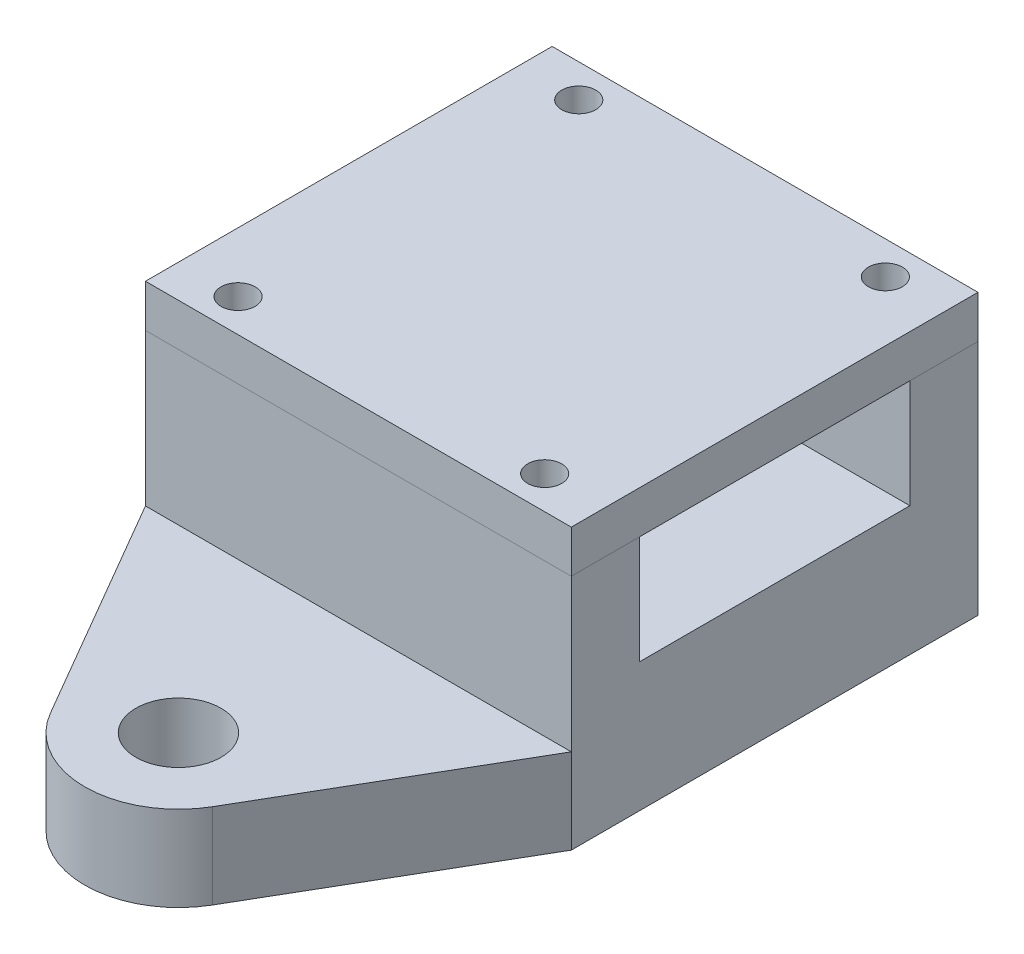
ISO-10303-21;
HEADER;
FILE_DESCRIPTION(('STEP AP214'),'2;1');
FILE_NAME('part.step','',(''),(''),'','','');
FILE_SCHEMA(('AUTOMOTIVE_DESIGN { 1 0 10303 214 1 1 1 1 }'));
ENDSEC;
DATA;
#1=APPLICATION_CONTEXT('core data for automotive mechanical design processes');
#2=APPLICATION_PROTOCOL_DEFINITION('international standard','automotive_design',2000,#1);
#3=PRODUCT_CONTEXT('',#1,'mechanical');
#4=PRODUCT('Part','Part','',(#3));
#5=PRODUCT_RELATED_PRODUCT_CATEGORY('part','',(#4));
#6=PRODUCT_DEFINITION_FORMATION('','',#4);
#7=PRODUCT_DEFINITION_CONTEXT('part definition',#1,'design');
#8=PRODUCT_DEFINITION('design','',#6,#7);
#9=PRODUCT_DEFINITION_SHAPE('','',#8);
#10=(LENGTH_UNIT() NAMED_UNIT(*) SI_UNIT(.MILLI.,.METRE.));
#11=(NAMED_UNIT(*) PLANE_ANGLE_UNIT() SI_UNIT($,.RADIAN.));
#12=(NAMED_UNIT(*) SI_UNIT($,.STERADIAN.) SOLID_ANGLE_UNIT());
#13=UNCERTAINTY_MEASURE_WITH_UNIT(LENGTH_MEASURE(1.E-05),#10,'distance_accuracy_value','');
#14=(GEOMETRIC_REPRESENTATION_CONTEXT(3) GLOBAL_UNCERTAINTY_ASSIGNED_CONTEXT((#13)) GLOBAL_UNIT_ASSIGNED_CONTEXT((#10,
#11,#12)) REPRESENTATION_CONTEXT('',''));
#15=CARTESIAN_POINT('',(0.,0.,0.));
#16=DIRECTION('',(0.,0.,1.));
#17=DIRECTION('',(1.,0.,0.));
#18=AXIS2_PLACEMENT_3D('',#15,#16,#17);
#19=CARTESIAN_POINT('',(-2634.2,685.964044395312,20.));
#20=DIRECTION('',(0.,1.,0.));
#21=DIRECTION('',(0.,0.,1.));
#22=AXIS2_PLACEMENT_3D('',#19,#20,#21);
#23=CYLINDRICAL_SURFACE('',#22,1.99999999999966);
#24=CARTESIAN_POINT('',(-2634.2,749.3,20.));
#25=DIRECTION('',(0.,1.,0.));
#26=DIRECTION('',(0.,0.,1.));
#27=AXIS2_PLACEMENT_3D('',#24,#25,#26);
#28=CIRCLE('',#27,1.99999999999966);
#29=CARTESIAN_POINT('',(-2634.2,749.3,21.9999999999997));
#30=VERTEX_POINT('',#29);
#31=EDGE_CURVE('E231',#30,#30,#28,.T.);
#32=ORIENTED_EDGE('',*,*,#31,.T.);
#33=EDGE_LOOP('',(#32));
#34=FACE_BOUND('',#33,.T.);
#35=CARTESIAN_POINT('',(-2634.2,721.45,20.));
#36=DIRECTION('',(0.,1.,0.));
#37=DIRECTION('',(0.,0.,1.));
#38=AXIS2_PLACEMENT_3D('',#35,#36,#37);
#39=CIRCLE('',#38,1.99999999999966);
#40=CARTESIAN_POINT('',(-2634.2,721.45,21.9999999999997));
#41=VERTEX_POINT('',#40);
#42=EDGE_CURVE('E206',#41,#41,#39,.T.);
#43=ORIENTED_EDGE('',*,*,#42,.F.);
#44=EDGE_LOOP('',(#43));
#45=FACE_BOUND('',#44,.T.);
#46=ADVANCED_FACE('F53',(#34,#45),#23,.F.);
#47=CARTESIAN_POINT('',(-2598.2,685.964044395312,20.));
#48=DIRECTION('',(0.,1.,0.));
#49=DIRECTION('',(0.,0.,1.));
#50=AXIS2_PLACEMENT_3D('',#47,#48,#49);
#51=CYLINDRICAL_SURFACE('',#50,1.99999999999966);
#52=CARTESIAN_POINT('',(-2598.2,749.3,20.));
#53=DIRECTION('',(0.,1.,0.));
#54=DIRECTION('',(0.,0.,1.));
#55=AXIS2_PLACEMENT_3D('',#52,#53,#54);
#56=CIRCLE('',#55,1.99999999999966);
#57=CARTESIAN_POINT('',(-2598.2,749.3,21.9999999999997));
#58=VERTEX_POINT('',#57);
#59=EDGE_CURVE('E227',#58,#58,#56,.T.);
#60=ORIENTED_EDGE('',*,*,#59,.T.);
#61=EDGE_LOOP('',(#60));
#62=FACE_BOUND('',#61,.T.);
#63=CARTESIAN_POINT('',(-2598.2,721.45,20.));
#64=DIRECTION('',(0.,1.,0.));
#65=DIRECTION('',(0.,0.,1.));
#66=AXIS2_PLACEMENT_3D('',#63,#64,#65);
#67=CIRCLE('',#66,1.99999999999966);
#68=CARTESIAN_POINT('',(-2598.2,721.45,21.9999999999997));
#69=VERTEX_POINT('',#68);
#70=EDGE_CURVE('E203',#69,#69,#67,.T.);
#71=ORIENTED_EDGE('',*,*,#70,.F.);
#72=EDGE_LOOP('',(#71));
#73=FACE_BOUND('',#72,.T.);
#74=ADVANCED_FACE('F55',(#62,#73),#51,.F.);
#75=CARTESIAN_POINT('',(0.,749.3,0.));
#76=DIRECTION('',(0.,1.,0.));
#77=DIRECTION('',(0.,0.,1.));
#78=AXIS2_PLACEMENT_3D('',#75,#76,#77);
#79=PLANE('',#78);
#80=ORIENTED_EDGE('',*,*,#59,.F.);
#81=EDGE_LOOP('',(#80));
#82=FACE_BOUND('',#81,.T.);
#83=ORIENTED_EDGE('',*,*,#31,.F.);
#84=EDGE_LOOP('',(#83));
#85=FACE_BOUND('',#84,.T.);
#86=DIRECTION('',(1.,0.,0.));
#87=VECTOR('',#86,1.);
#88=CARTESIAN_POINT('',(0.,749.3,15.875));
#89=LINE('',#88,#87);
#90=CARTESIAN_POINT('',(-2641.2,749.3,15.8749999999999));
#91=VERTEX_POINT('',#90);
#92=CARTESIAN_POINT('',(-2591.2,749.3,15.8749999999999));
#93=VERTEX_POINT('',#92);
#94=EDGE_CURVE('E234',#91,#93,#89,.T.);
#95=ORIENTED_EDGE('',*,*,#94,.F.);
#96=DIRECTION('',(0.,0.,-1.));
#97=VECTOR('',#96,1.);
#98=CARTESIAN_POINT('',(-2641.2,749.3,0.));
#99=LINE('',#98,#97);
#100=CARTESIAN_POINT('',(-2641.2,749.3,23.875));
#101=VERTEX_POINT('',#100);
#102=EDGE_CURVE('E237',#101,#91,#99,.T.);
#103=ORIENTED_EDGE('',*,*,#102,.F.);
#104=DIRECTION('',(1.,0.,0.));
#105=VECTOR('',#104,1.);
#106=CARTESIAN_POINT('',(0.,749.3,23.875));
#107=LINE('',#106,#105);
#108=CARTESIAN_POINT('',(-2591.2,749.3,23.875));
#109=VERTEX_POINT('',#108);
#110=EDGE_CURVE('E240',#101,#109,#107,.T.);
#111=ORIENTED_EDGE('',*,*,#110,.T.);
#112=DIRECTION('',(0.,0.,1.));
#113=VECTOR('',#112,1.);
#114=CARTESIAN_POINT('',(-2591.2,749.3,0.));
#115=LINE('',#114,#113);
#116=EDGE_CURVE('E243',#93,#109,#115,.T.);
#117=ORIENTED_EDGE('',*,*,#116,.F.);
#118=EDGE_LOOP('',(#95,#103,#111,#117));
#119=FACE_BOUND('',#118,.T.);
#120=ADVANCED_FACE('F264',(#82,#85,#119),#79,.T.);
#121=CARTESIAN_POINT('',(-2641.2,685.964044395312,0.));
#122=DIRECTION('',(1.,0.,0.));
#123=DIRECTION('',(0.,0.,-1.));
#124=AXIS2_PLACEMENT_3D('',#121,#122,#123);
#125=PLANE('',#124);
#126=DIRECTION('',(0.,1.,0.));
#127=VECTOR('',#126,1.);
#128=CARTESIAN_POINT('',(-2641.2,685.964044395312,15.8749999999999));
#129=LINE('',#128,#127);
#130=CARTESIAN_POINT('',(-2641.2,736.6,15.8749999999999));
#131=VERTEX_POINT('',#130);
#132=EDGE_CURVE('E57',#131,#91,#129,.T.);
#133=ORIENTED_EDGE('',*,*,#132,.F.);
#134=DIRECTION('',(0.,0.,-1.));
#135=VECTOR('',#134,1.);
#136=CARTESIAN_POINT('',(-2641.2,736.6,0.));
#137=LINE('',#136,#135);
#138=CARTESIAN_POINT('',(-2641.2,736.6,-15.8749999999999));
#139=VERTEX_POINT('',#138);
#140=EDGE_CURVE('E217',#131,#139,#137,.T.);
#141=ORIENTED_EDGE('',*,*,#140,.T.);
#142=DIRECTION('',(0.,1.,0.));
#143=VECTOR('',#142,1.);
#144=CARTESIAN_POINT('',(-2641.2,685.964044395312,-15.8749999999999));
#145=LINE('',#144,#143);
#146=CARTESIAN_POINT('',(-2641.2,749.3,-15.8749999999999));
#147=VERTEX_POINT('',#146);
#148=EDGE_CURVE('E78',#139,#147,#145,.T.);
#149=ORIENTED_EDGE('',*,*,#148,.T.);
#150=DIRECTION('',(0.,0.,-1.));
#151=VECTOR('',#150,1.);
#152=CARTESIAN_POINT('',(-2641.2,749.3,0.));
#153=LINE('',#152,#151);
#154=CARTESIAN_POINT('',(-2641.2,749.3,-23.8749999999999));
#155=VERTEX_POINT('',#154);
#156=EDGE_CURVE('E181',#147,#155,#153,.T.);
#157=ORIENTED_EDGE('',*,*,#156,.T.);
#158=DIRECTION('',(0.,1.,0.));
#159=VECTOR('',#158,1.);
#160=CARTESIAN_POINT('',(-2641.2,721.45,-23.8749999999999));
#161=LINE('',#160,#159);
#162=CARTESIAN_POINT('',(-2641.2,721.45,-23.8749999999999));
#163=VERTEX_POINT('',#162);
#164=EDGE_CURVE('E225',#163,#155,#161,.T.);
#165=ORIENTED_EDGE('',*,*,#164,.F.);
#166=DIRECTION('',(0.,0.,-1.));
#167=VECTOR('',#166,1.);
#168=CARTESIAN_POINT('',(-2641.2,721.45,0.));
#169=LINE('',#168,#167);
#170=CARTESIAN_POINT('',(-2641.2,721.45,23.875));
#171=VERTEX_POINT('',#170);
#172=EDGE_CURVE('E219',#171,#163,#169,.T.);
#173=ORIENTED_EDGE('',*,*,#172,.F.);
#174=DIRECTION('',(0.,1.,0.));
#175=VECTOR('',#174,1.);
#176=CARTESIAN_POINT('',(-2641.2,685.964044395312,23.875));
#177=LINE('',#176,#175);
#178=CARTESIAN_POINT('',(-2641.2,731.45,23.875));
#179=VERTEX_POINT('',#178);
#180=EDGE_CURVE('E250',#171,#179,#177,.T.);
#181=ORIENTED_EDGE('',*,*,#180,.T.);
#182=EDGE_CURVE('E251',#179,#101,#177,.T.);
#183=ORIENTED_EDGE('',*,*,#182,.T.);
#184=ORIENTED_EDGE('',*,*,#102,.T.);
#185=EDGE_LOOP('',(#133,#141,#149,#157,#165,#173,#181,#183,#184));
#186=FACE_BOUND('',#185,.T.);
#187=ADVANCED_FACE('F260',(#186),#125,.F.);
#188=CARTESIAN_POINT('',(0.,685.964044395312,23.875));
#189=DIRECTION('',(0.,0.,1.));
#190=DIRECTION('',(1.,0.,0.));
#191=AXIS2_PLACEMENT_3D('',#188,#189,#190);
#192=PLANE('',#191);
#193=DIRECTION('',(-1.,0.,0.));
#194=VECTOR('',#193,1.);
#195=CARTESIAN_POINT('',(0.,731.45,23.875));
#196=LINE('',#195,#194);
#197=CARTESIAN_POINT('',(-2591.2,731.45,23.875));
#198=VERTEX_POINT('',#197);
#199=EDGE_CURVE('E70',#198,#179,#196,.T.);
#200=ORIENTED_EDGE('',*,*,#199,.F.);
#201=DIRECTION('',(0.,1.,0.));
#202=VECTOR('',#201,1.);
#203=CARTESIAN_POINT('',(-2591.2,685.964044395312,23.875));
#204=LINE('',#203,#202);
#205=EDGE_CURVE('E249',#198,#109,#204,.T.);
#206=ORIENTED_EDGE('',*,*,#205,.T.);
#207=ORIENTED_EDGE('',*,*,#110,.F.);
#208=ORIENTED_EDGE('',*,*,#182,.F.);
#209=EDGE_LOOP('',(#200,#206,#207,#208));
#210=FACE_BOUND('',#209,.T.);
#211=ADVANCED_FACE('F309',(#210),#192,.T.);
#212=CARTESIAN_POINT('',(-2591.2,685.964044395312,0.));
#213=DIRECTION('',(-1.,0.,0.));
#214=DIRECTION('',(0.,0.,1.));
#215=AXIS2_PLACEMENT_3D('',#212,#213,#214);
#216=PLANE('',#215);
#217=CARTESIAN_POINT('',(-2591.2,721.45,23.875));
#218=VERTEX_POINT('',#217);
#219=EDGE_CURVE('E247',#218,#198,#204,.T.);
#220=ORIENTED_EDGE('',*,*,#219,.F.);
#221=DIRECTION('',(0.,0.,1.));
#222=VECTOR('',#221,1.);
#223=CARTESIAN_POINT('',(-2591.2,721.45,0.));
#224=LINE('',#223,#222);
#225=CARTESIAN_POINT('',(-2591.2,721.45,-23.8749999999999));
#226=VERTEX_POINT('',#225);
#227=EDGE_CURVE('E213',#226,#218,#224,.T.);
#228=ORIENTED_EDGE('',*,*,#227,.F.);
#229=DIRECTION('',(0.,1.,0.));
#230=VECTOR('',#229,1.);
#231=CARTESIAN_POINT('',(-2591.2,721.45,-23.8749999999999));
#232=LINE('',#231,#230);
#233=CARTESIAN_POINT('',(-2591.2,749.3,-23.8749999999999));
#234=VERTEX_POINT('',#233);
#235=EDGE_CURVE('E221',#226,#234,#232,.T.);
#236=ORIENTED_EDGE('',*,*,#235,.T.);
#237=DIRECTION('',(0.,0.,1.));
#238=VECTOR('',#237,1.);
#239=CARTESIAN_POINT('',(-2591.2,749.3,0.));
#240=LINE('',#239,#238);
#241=CARTESIAN_POINT('',(-2591.2,749.3,-15.8749999999999));
#242=VERTEX_POINT('',#241);
#243=EDGE_CURVE('E180',#234,#242,#240,.T.);
#244=ORIENTED_EDGE('',*,*,#243,.T.);
#245=DIRECTION('',(0.,1.,0.));
#246=VECTOR('',#245,1.);
#247=CARTESIAN_POINT('',(-2591.2,685.964044395312,-15.8749999999999));
#248=LINE('',#247,#246);
#249=CARTESIAN_POINT('',(-2591.2,736.6,-15.8749999999999));
#250=VERTEX_POINT('',#249);
#251=EDGE_CURVE('E189',#250,#242,#248,.T.);
#252=ORIENTED_EDGE('',*,*,#251,.F.);
#253=DIRECTION('',(0.,0.,1.));
#254=VECTOR('',#253,1.);
#255=CARTESIAN_POINT('',(-2591.2,736.6,0.));
#256=LINE('',#255,#254);
#257=CARTESIAN_POINT('',(-2591.2,736.6,15.8749999999999));
#258=VERTEX_POINT('',#257);
#259=EDGE_CURVE('E212',#250,#258,#256,.T.);
#260=ORIENTED_EDGE('',*,*,#259,.T.);
#261=DIRECTION('',(0.,1.,0.));
#262=VECTOR('',#261,1.);
#263=CARTESIAN_POINT('',(-2591.2,685.964044395312,15.8749999999999));
#264=LINE('',#263,#262);
#265=EDGE_CURVE('E62',#258,#93,#264,.T.);
#266=ORIENTED_EDGE('',*,*,#265,.T.);
#267=ORIENTED_EDGE('',*,*,#116,.T.);
#268=ORIENTED_EDGE('',*,*,#205,.F.);
#269=EDGE_LOOP('',(#220,#228,#236,#244,#252,#260,#266,#267,#268));
#270=FACE_BOUND('',#269,.T.);
#271=ADVANCED_FACE('F266',(#270),#216,.F.);
#272=CARTESIAN_POINT('',(0.,685.964044395312,15.875));
#273=DIRECTION('',(0.,0.,1.));
#274=DIRECTION('',(1.,0.,0.));
#275=AXIS2_PLACEMENT_3D('',#272,#273,#274);
#276=PLANE('',#275);
#277=ORIENTED_EDGE('',*,*,#265,.F.);
#278=DIRECTION('',(-1.,0.,0.));
#279=VECTOR('',#278,1.);
#280=CARTESIAN_POINT('',(0.,736.6,15.875));
#281=LINE('',#280,#279);
#282=EDGE_CURVE('E12',#258,#131,#281,.T.);
#283=ORIENTED_EDGE('',*,*,#282,.T.);
#284=ORIENTED_EDGE('',*,*,#132,.T.);
#285=ORIENTED_EDGE('',*,*,#94,.T.);
#286=EDGE_LOOP('',(#277,#283,#284,#285));
#287=FACE_BOUND('',#286,.T.);
#288=ADVANCED_FACE('F257',(#287),#276,.F.);
#289=CARTESIAN_POINT('',(-2997.2,721.45,-23.8749999999999));
#290=DIRECTION('',(0.,0.,1.));
#291=DIRECTION('',(1.,0.,0.));
#292=AXIS2_PLACEMENT_3D('',#289,#290,#291);
#293=PLANE('',#292);
#294=ORIENTED_EDGE('',*,*,#164,.T.);
#295=DIRECTION('',(1.,0.,0.));
#296=VECTOR('',#295,1.);
#297=CARTESIAN_POINT('',(0.,749.3,-23.8749999999999));
#298=LINE('',#297,#296);
#299=EDGE_CURVE('E177',#155,#234,#298,.T.);
#300=ORIENTED_EDGE('',*,*,#299,.T.);
#301=ORIENTED_EDGE('',*,*,#235,.F.);
#302=DIRECTION('',(1.,0.,0.));
#303=VECTOR('',#302,1.);
#304=CARTESIAN_POINT('',(-2997.2,721.45,-23.8749999999999));
#305=LINE('',#304,#303);
#306=EDGE_CURVE('E216',#163,#226,#305,.T.);
#307=ORIENTED_EDGE('',*,*,#306,.F.);
#308=EDGE_LOOP('',(#294,#300,#301,#307));
#309=FACE_BOUND('',#308,.T.);
#310=ADVANCED_FACE('F281',(#309),#293,.F.);
#311=CARTESIAN_POINT('',(0.,721.45,0.));
#312=DIRECTION('',(0.,-1.,0.));
#313=DIRECTION('',(0.,0.,-1.));
#314=AXIS2_PLACEMENT_3D('',#311,#312,#313);
#315=PLANE('',#314);
#316=CARTESIAN_POINT('',(-2634.2,721.45,-20.));
#317=DIRECTION('',(0.,1.,0.));
#318=DIRECTION('',(0.,0.,1.));
#319=AXIS2_PLACEMENT_3D('',#316,#317,#318);
#320=CIRCLE('',#319,1.99999999999966);
#321=CARTESIAN_POINT('',(-2634.2,721.45,-18.0000000000003));
#322=VERTEX_POINT('',#321);
#323=EDGE_CURVE('E198',#322,#322,#320,.T.);
#324=ORIENTED_EDGE('',*,*,#323,.T.);
#325=EDGE_LOOP('',(#324));
#326=FACE_BOUND('',#325,.T.);
#327=ORIENTED_EDGE('',*,*,#70,.T.);
#328=EDGE_LOOP('',(#327));
#329=FACE_BOUND('',#328,.T.);
#330=ORIENTED_EDGE('',*,*,#42,.T.);
#331=EDGE_LOOP('',(#330));
#332=FACE_BOUND('',#331,.T.);
#333=CARTESIAN_POINT('',(-2598.2,721.45,-20.));
#334=DIRECTION('',(0.,1.,0.));
#335=DIRECTION('',(0.,0.,1.));
#336=AXIS2_PLACEMENT_3D('',#333,#334,#335);
#337=CIRCLE('',#336,1.99999999999966);
#338=CARTESIAN_POINT('',(-2598.2,721.45,-18.0000000000003));
#339=VERTEX_POINT('',#338);
#340=EDGE_CURVE('E209',#339,#339,#337,.T.);
#341=ORIENTED_EDGE('',*,*,#340,.T.);
#342=EDGE_LOOP('',(#341));
#343=FACE_BOUND('',#342,.T.);
#344=ORIENTED_EDGE('',*,*,#227,.T.);
#345=DIRECTION('',(0.502475254915901,0.,-0.864591590403932));
#346=VECTOR('',#345,1.);
#347=CARTESIAN_POINT('',(-1926.59808684269,721.45,-1119.68225871187));
#348=LINE('',#347,#346);
#349=CARTESIAN_POINT('',(-2606.68949250556,721.45,50.5272278040751));
#350=VERTEX_POINT('',#349);
#351=EDGE_CURVE('E162',#350,#218,#348,.T.);
#352=ORIENTED_EDGE('',*,*,#351,.F.);
#353=CARTESIAN_POINT('',(-2616.2,721.45,45.));
#354=DIRECTION('',(0.,-1.,0.));
#355=DIRECTION('',(0.,0.,-1.));
#356=AXIS2_PLACEMENT_3D('',#353,#354,#355);
#357=CIRCLE('',#356,10.9999999999998);
#358=CARTESIAN_POINT('',(-2625.71050749444,721.45,50.5272278040745));
#359=VERTEX_POINT('',#358);
#360=EDGE_CURVE('E172',#350,#359,#357,.T.);
#361=ORIENTED_EDGE('',*,*,#360,.T.);
#362=DIRECTION('',(-0.502475254915901,0.,-0.864591590403932));
#363=VECTOR('',#362,1.);
#364=CARTESIAN_POINT('',(-1984.71833101234,721.45,1153.46003868228));
#365=LINE('',#364,#363);
#366=EDGE_CURVE('E146',#359,#171,#365,.T.);
#367=ORIENTED_EDGE('',*,*,#366,.T.);
#368=ORIENTED_EDGE('',*,*,#172,.T.);
#369=ORIENTED_EDGE('',*,*,#306,.T.);
#370=EDGE_LOOP('',(#344,#352,#361,#367,#368,#369));
#371=FACE_BOUND('',#370,.T.);
#372=CARTESIAN_POINT('',(-2616.2,721.45,45.));
#373=DIRECTION('',(0.,-1.,0.));
#374=DIRECTION('',(0.,0.,-1.));
#375=AXIS2_PLACEMENT_3D('',#372,#373,#374);
#376=CIRCLE('',#375,4.99999999999982);
#377=CARTESIAN_POINT('',(-2616.2,721.45,40.0000000000002));
#378=VERTEX_POINT('',#377);
#379=EDGE_CURVE('E167',#378,#378,#376,.T.);
#380=ORIENTED_EDGE('',*,*,#379,.F.);
#381=EDGE_LOOP('',(#380));
#382=FACE_BOUND('',#381,.T.);
#383=ADVANCED_FACE('F283',(#326,#329,#332,#343,#371,#382),#315,.T.);
#384=CARTESIAN_POINT('',(0.,736.6,0.));
#385=DIRECTION('',(0.,-1.,0.));
#386=DIRECTION('',(0.,0.,-1.));
#387=AXIS2_PLACEMENT_3D('',#384,#385,#386);
#388=PLANE('',#387);
#389=ORIENTED_EDGE('',*,*,#259,.F.);
#390=DIRECTION('',(-1.,0.,0.));
#391=VECTOR('',#390,1.);
#392=CARTESIAN_POINT('',(0.,736.6,-15.8749999999997));
#393=LINE('',#392,#391);
#394=EDGE_CURVE('E188',#250,#139,#393,.T.);
#395=ORIENTED_EDGE('',*,*,#394,.T.);
#396=ORIENTED_EDGE('',*,*,#140,.F.);
#397=ORIENTED_EDGE('',*,*,#282,.F.);
#398=EDGE_LOOP('',(#389,#395,#396,#397));
#399=FACE_BOUND('',#398,.T.);
#400=ADVANCED_FACE('F269',(#399),#388,.F.);
#401=CARTESIAN_POINT('',(-2598.2,721.45,-20.));
#402=DIRECTION('',(0.,1.,0.));
#403=DIRECTION('',(0.,0.,1.));
#404=AXIS2_PLACEMENT_3D('',#401,#402,#403);
#405=CYLINDRICAL_SURFACE('',#404,1.99999999999966);
#406=CARTESIAN_POINT('',(-2598.2,749.3,-20.));
#407=DIRECTION('',(0.,1.,0.));
#408=DIRECTION('',(0.,0.,1.));
#409=AXIS2_PLACEMENT_3D('',#406,#407,#408);
#410=CIRCLE('',#409,1.99999999999966);
#411=CARTESIAN_POINT('',(-2598.2,749.3,-18.0000000000003));
#412=VERTEX_POINT('',#411);
#413=EDGE_CURVE('E194',#412,#412,#410,.T.);
#414=CARTESIAN_POINT('',(-2598.2,721.45,-18.0000000000003));
#415=CARTESIAN_POINT('',(-2598.2,721.740104166667,-18.0000000000003));
#416=CARTESIAN_POINT('',(-2598.2,722.030208333334,-18.0000000000003));
#417=CARTESIAN_POINT('',(-2598.2,722.610416666667,-18.0000000000003));
#418=CARTESIAN_POINT('',(-2598.2,722.900520833334,-18.0000000000003));
#419=CARTESIAN_POINT('',(-2598.2,723.480729166667,-18.0000000000003));
#420=CARTESIAN_POINT('',(-2598.2,723.770833333334,-18.0000000000003));
#421=CARTESIAN_POINT('',(-2598.2,724.351041666667,-18.0000000000003));
#422=CARTESIAN_POINT('',(-2598.2,724.641145833334,-18.0000000000003));
#423=CARTESIAN_POINT('',(-2598.2,725.221354166667,-18.0000000000003));
#424=CARTESIAN_POINT('',(-2598.2,725.511458333334,-18.0000000000003));
#425=CARTESIAN_POINT('',(-2598.2,726.091666666667,-18.0000000000003));
#426=CARTESIAN_POINT('',(-2598.2,726.381770833334,-18.0000000000003));
#427=CARTESIAN_POINT('',(-2598.2,726.961979166667,-18.0000000000003));
#428=CARTESIAN_POINT('',(-2598.2,727.252083333334,-18.0000000000003));
#429=CARTESIAN_POINT('',(-2598.2,727.832291666667,-18.0000000000003));
#430=CARTESIAN_POINT('',(-2598.2,728.122395833334,-18.0000000000003));
#431=CARTESIAN_POINT('',(-2598.2,728.702604166667,-18.0000000000003));
#432=CARTESIAN_POINT('',(-2598.2,728.992708333334,-18.0000000000003));
#433=CARTESIAN_POINT('',(-2598.2,729.572916666667,-18.0000000000003));
#434=CARTESIAN_POINT('',(-2598.2,729.863020833334,-18.0000000000003));
#435=CARTESIAN_POINT('',(-2598.2,730.443229166667,-18.0000000000003));
#436=CARTESIAN_POINT('',(-2598.2,730.733333333334,-18.0000000000003));
#437=CARTESIAN_POINT('',(-2598.2,731.313541666667,-18.0000000000003));
#438=CARTESIAN_POINT('',(-2598.2,731.603645833334,-18.0000000000003));
#439=CARTESIAN_POINT('',(-2598.2,732.183854166667,-18.0000000000003));
#440=CARTESIAN_POINT('',(-2598.2,732.473958333334,-18.0000000000003));
#441=CARTESIAN_POINT('',(-2598.2,733.054166666667,-18.0000000000003));
#442=CARTESIAN_POINT('',(-2598.2,733.344270833334,-18.0000000000003));
#443=CARTESIAN_POINT('',(-2598.2,733.924479166667,-18.0000000000003));
#444=CARTESIAN_POINT('',(-2598.2,734.214583333334,-18.0000000000003));
#445=CARTESIAN_POINT('',(-2598.2,734.794791666667,-18.0000000000003));
#446=CARTESIAN_POINT('',(-2598.2,735.084895833334,-18.0000000000003));
#447=CARTESIAN_POINT('',(-2598.2,735.665104166667,-18.0000000000003));
#448=CARTESIAN_POINT('',(-2598.2,735.955208333334,-18.0000000000003));
#449=CARTESIAN_POINT('',(-2598.2,736.535416666667,-18.0000000000003));
#450=CARTESIAN_POINT('',(-2598.2,736.825520833334,-18.0000000000003));
#451=CARTESIAN_POINT('',(-2598.2,737.405729166667,-18.0000000000003));
#452=CARTESIAN_POINT('',(-2598.2,737.695833333334,-18.0000000000003));
#453=CARTESIAN_POINT('',(-2598.2,738.276041666667,-18.0000000000003));
#454=CARTESIAN_POINT('',(-2598.2,738.566145833334,-18.0000000000003));
#455=CARTESIAN_POINT('',(-2598.2,739.146354166667,-18.0000000000003));
#456=CARTESIAN_POINT('',(-2598.2,739.436458333334,-18.0000000000003));
#457=CARTESIAN_POINT('',(-2598.2,740.016666666667,-18.0000000000003));
#458=CARTESIAN_POINT('',(-2598.2,740.306770833334,-18.0000000000003));
#459=CARTESIAN_POINT('',(-2598.2,740.886979166667,-18.0000000000003));
#460=CARTESIAN_POINT('',(-2598.2,741.177083333333,-18.0000000000003));
#461=CARTESIAN_POINT('',(-2598.2,741.757291666667,-18.0000000000003));
#462=CARTESIAN_POINT('',(-2598.2,742.047395833334,-18.0000000000003));
#463=CARTESIAN_POINT('',(-2598.2,742.627604166667,-18.0000000000003));
#464=CARTESIAN_POINT('',(-2598.2,742.917708333334,-18.0000000000003));
#465=CARTESIAN_POINT('',(-2598.2,743.497916666667,-18.0000000000003));
#466=CARTESIAN_POINT('',(-2598.2,743.788020833334,-18.0000000000003));
#467=CARTESIAN_POINT('',(-2598.2,744.368229166667,-18.0000000000003));
#468=CARTESIAN_POINT('',(-2598.2,744.658333333334,-18.0000000000003));
#469=CARTESIAN_POINT('',(-2598.2,745.238541666667,-18.0000000000003));
#470=CARTESIAN_POINT('',(-2598.2,745.528645833334,-18.0000000000003));
#471=CARTESIAN_POINT('',(-2598.2,746.108854166667,-18.0000000000003));
#472=CARTESIAN_POINT('',(-2598.2,746.398958333334,-18.0000000000003));
#473=CARTESIAN_POINT('',(-2598.2,746.979166666667,-18.0000000000003));
#474=CARTESIAN_POINT('',(-2598.2,747.269270833334,-18.0000000000003));
#475=CARTESIAN_POINT('',(-2598.2,747.849479166667,-18.0000000000003));
#476=CARTESIAN_POINT('',(-2598.2,748.139583333334,-18.0000000000003));
#477=CARTESIAN_POINT('',(-2598.2,748.719791666667,-18.0000000000003));
#478=CARTESIAN_POINT('',(-2598.2,749.009895833334,-18.0000000000003));
#479=CARTESIAN_POINT('',(-2598.2,749.3,-18.0000000000003));
#480=B_SPLINE_CURVE_WITH_KNOTS('',3,(#414,#415,#416,#417,#418,#419,#420,#421,#422,#423,#424,
#425,#426,#427,#428,#429,#430,#431,#432,#433,#434,#435,#436,#437,#438,#439,#440,#441,#442,#443,
#444,#445,#446,#447,#448,#449,#450,#451,#452,#453,#454,#455,#456,#457,#458,#459,#460,#461,#462,
#463,#464,#465,#466,#467,#468,#469,#470,#471,#472,#473,#474,#475,#476,#477,#478,#479),
.UNSPECIFIED.,.F.,.F.,(4,2,2,2,2,2,2,2,2,2,2,2,2,2,2,2,2,2,2,2,2,2,2,2,2,2,2,2,2,2,2,2,4),(0.,
0.870312499999915,1.74062499999994,2.61093749999997,3.48124999999999,4.35156249999991,
5.22187499999993,6.09218749999996,6.96249999999998,7.83281250000001,8.70312499999992,
9.57343749999995,10.44375,11.3140625,12.1843749999999,13.0546874999999,13.925,14.7953125,
15.665625,16.5359374999999,17.40625,18.2765625,19.146875,20.0171874999999,20.8874999999999,
21.7578125,22.628125,23.4984375,24.3687499999999,25.2390625,26.109375,26.9796875,
27.8499999999999),.UNSPECIFIED.);
#481=EDGE_CURVE('BSEAM321',#339,#412,#480,.T.);
#482=ORIENTED_EDGE('',*,*,#340,.F.);
#483=ORIENTED_EDGE('',*,*,#413,.T.);
#484=ORIENTED_EDGE('',*,*,#481,.T.);
#485=ORIENTED_EDGE('',*,*,#481,.F.);
#486=EDGE_LOOP('',(#482,#484,#483,#485));
#487=FACE_BOUND('',#486,.T.);
#488=ADVANCED_FACE('F321',(#487),#405,.F.);
#489=CARTESIAN_POINT('',(-2634.2,721.45,-20.));
#490=DIRECTION('',(0.,1.,0.));
#491=DIRECTION('',(0.,0.,1.));
#492=AXIS2_PLACEMENT_3D('',#489,#490,#491);
#493=CYLINDRICAL_SURFACE('',#492,1.99999999999966);
#494=CARTESIAN_POINT('',(-2634.2,749.3,-20.));
#495=DIRECTION('',(0.,1.,0.));
#496=DIRECTION('',(0.,0.,1.));
#497=AXIS2_PLACEMENT_3D('',#494,#495,#496);
#498=CIRCLE('',#497,1.99999999999966);
#499=CARTESIAN_POINT('',(-2634.2,749.3,-18.0000000000003));
#500=VERTEX_POINT('',#499);
#501=EDGE_CURVE('E184',#500,#500,#498,.T.);
#502=CARTESIAN_POINT('',(-2634.2,721.45,-18.0000000000003));
#503=CARTESIAN_POINT('',(-2634.2,721.740104166667,-18.0000000000003));
#504=CARTESIAN_POINT('',(-2634.2,722.030208333334,-18.0000000000003));
#505=CARTESIAN_POINT('',(-2634.2,722.610416666667,-18.0000000000003));
#506=CARTESIAN_POINT('',(-2634.2,722.900520833334,-18.0000000000003));
#507=CARTESIAN_POINT('',(-2634.2,723.480729166667,-18.0000000000003));
#508=CARTESIAN_POINT('',(-2634.2,723.770833333334,-18.0000000000003));
#509=CARTESIAN_POINT('',(-2634.2,724.351041666667,-18.0000000000003));
#510=CARTESIAN_POINT('',(-2634.2,724.641145833334,-18.0000000000003));
#511=CARTESIAN_POINT('',(-2634.2,725.221354166667,-18.0000000000003));
#512=CARTESIAN_POINT('',(-2634.2,725.511458333334,-18.0000000000003));
#513=CARTESIAN_POINT('',(-2634.2,726.091666666667,-18.0000000000003));
#514=CARTESIAN_POINT('',(-2634.2,726.381770833334,-18.0000000000003));
#515=CARTESIAN_POINT('',(-2634.2,726.961979166667,-18.0000000000003));
#516=CARTESIAN_POINT('',(-2634.2,727.252083333334,-18.0000000000003));
#517=CARTESIAN_POINT('',(-2634.2,727.832291666667,-18.0000000000003));
#518=CARTESIAN_POINT('',(-2634.2,728.122395833334,-18.0000000000003));
#519=CARTESIAN_POINT('',(-2634.2,728.702604166667,-18.0000000000003));
#520=CARTESIAN_POINT('',(-2634.2,728.992708333334,-18.0000000000003));
#521=CARTESIAN_POINT('',(-2634.2,729.572916666667,-18.0000000000003));
#522=CARTESIAN_POINT('',(-2634.2,729.863020833334,-18.0000000000003));
#523=CARTESIAN_POINT('',(-2634.2,730.443229166667,-18.0000000000003));
#524=CARTESIAN_POINT('',(-2634.2,730.733333333334,-18.0000000000003));
#525=CARTESIAN_POINT('',(-2634.2,731.313541666667,-18.0000000000003));
#526=CARTESIAN_POINT('',(-2634.2,731.603645833334,-18.0000000000003));
#527=CARTESIAN_POINT('',(-2634.2,732.183854166667,-18.0000000000003));
#528=CARTESIAN_POINT('',(-2634.2,732.473958333334,-18.0000000000003));
#529=CARTESIAN_POINT('',(-2634.2,733.054166666667,-18.0000000000003));
#530=CARTESIAN_POINT('',(-2634.2,733.344270833334,-18.0000000000003));
#531=CARTESIAN_POINT('',(-2634.2,733.924479166667,-18.0000000000003));
#532=CARTESIAN_POINT('',(-2634.2,734.214583333334,-18.0000000000003));
#533=CARTESIAN_POINT('',(-2634.2,734.794791666667,-18.0000000000003));
#534=CARTESIAN_POINT('',(-2634.2,735.084895833334,-18.0000000000003));
#535=CARTESIAN_POINT('',(-2634.2,735.665104166667,-18.0000000000003));
#536=CARTESIAN_POINT('',(-2634.2,735.955208333334,-18.0000000000003));
#537=CARTESIAN_POINT('',(-2634.2,736.535416666667,-18.0000000000003));
#538=CARTESIAN_POINT('',(-2634.2,736.825520833334,-18.0000000000003));
#539=CARTESIAN_POINT('',(-2634.2,737.405729166667,-18.0000000000003));
#540=CARTESIAN_POINT('',(-2634.2,737.695833333334,-18.0000000000003));
#541=CARTESIAN_POINT('',(-2634.2,738.276041666667,-18.0000000000003));
#542=CARTESIAN_POINT('',(-2634.2,738.566145833334,-18.0000000000003));
#543=CARTESIAN_POINT('',(-2634.2,739.146354166667,-18.0000000000003));
#544=CARTESIAN_POINT('',(-2634.2,739.436458333334,-18.0000000000003));
#545=CARTESIAN_POINT('',(-2634.2,740.016666666667,-18.0000000000003));
#546=CARTESIAN_POINT('',(-2634.2,740.306770833334,-18.0000000000003));
#547=CARTESIAN_POINT('',(-2634.2,740.886979166667,-18.0000000000003));
#548=CARTESIAN_POINT('',(-2634.2,741.177083333333,-18.0000000000003));
#549=CARTESIAN_POINT('',(-2634.2,741.757291666667,-18.0000000000003));
#550=CARTESIAN_POINT('',(-2634.2,742.047395833334,-18.0000000000003));
#551=CARTESIAN_POINT('',(-2634.2,742.627604166667,-18.0000000000003));
#552=CARTESIAN_POINT('',(-2634.2,742.917708333334,-18.0000000000003));
#553=CARTESIAN_POINT('',(-2634.2,743.497916666667,-18.0000000000003));
#554=CARTESIAN_POINT('',(-2634.2,743.788020833334,-18.0000000000003));
#555=CARTESIAN_POINT('',(-2634.2,744.368229166667,-18.0000000000003));
#556=CARTESIAN_POINT('',(-2634.2,744.658333333334,-18.0000000000003));
#557=CARTESIAN_POINT('',(-2634.2,745.238541666667,-18.0000000000003));
#558=CARTESIAN_POINT('',(-2634.2,745.528645833334,-18.0000000000003));
#559=CARTESIAN_POINT('',(-2634.2,746.108854166667,-18.0000000000003));
#560=CARTESIAN_POINT('',(-2634.2,746.398958333334,-18.0000000000003));
#561=CARTESIAN_POINT('',(-2634.2,746.979166666667,-18.0000000000003));
#562=CARTESIAN_POINT('',(-2634.2,747.269270833334,-18.0000000000003));
#563=CARTESIAN_POINT('',(-2634.2,747.849479166667,-18.0000000000003));
#564=CARTESIAN_POINT('',(-2634.2,748.139583333334,-18.0000000000003));
#565=CARTESIAN_POINT('',(-2634.2,748.719791666667,-18.0000000000003));
#566=CARTESIAN_POINT('',(-2634.2,749.009895833334,-18.0000000000003));
#567=CARTESIAN_POINT('',(-2634.2,749.3,-18.0000000000003));
#568=B_SPLINE_CURVE_WITH_KNOTS('',3,(#502,#503,#504,#505,#506,#507,#508,#509,#510,#511,#512,
#513,#514,#515,#516,#517,#518,#519,#520,#521,#522,#523,#524,#525,#526,#527,#528,#529,#530,#531,
#532,#533,#534,#535,#536,#537,#538,#539,#540,#541,#542,#543,#544,#545,#546,#547,#548,#549,#550,
#551,#552,#553,#554,#555,#556,#557,#558,#559,#560,#561,#562,#563,#564,#565,#566,#567),
.UNSPECIFIED.,.F.,.F.,(4,2,2,2,2,2,2,2,2,2,2,2,2,2,2,2,2,2,2,2,2,2,2,2,2,2,2,2,2,2,2,2,4),(0.,
0.870312499999915,1.74062499999994,2.61093749999997,3.48124999999999,4.35156249999991,
5.22187499999993,6.09218749999996,6.96249999999998,7.83281250000001,8.70312499999992,
9.57343749999995,10.44375,11.3140625,12.1843749999999,13.0546874999999,13.925,14.7953125,
15.665625,16.5359374999999,17.40625,18.2765625,19.146875,20.0171874999999,20.8874999999999,
21.7578125,22.628125,23.4984375,24.3687499999999,25.2390625,26.109375,26.9796875,
27.8499999999999),.UNSPECIFIED.);
#569=EDGE_CURVE('BSEAM327',#322,#500,#568,.T.);
#570=ORIENTED_EDGE('',*,*,#323,.F.);
#571=ORIENTED_EDGE('',*,*,#501,.T.);
#572=ORIENTED_EDGE('',*,*,#569,.T.);
#573=ORIENTED_EDGE('',*,*,#569,.F.);
#574=EDGE_LOOP('',(#570,#572,#571,#573));
#575=FACE_BOUND('',#574,.T.);
#576=ADVANCED_FACE('F327',(#575),#493,.F.);
#577=CARTESIAN_POINT('',(0.,685.964044395312,-15.8749999999997));
#578=DIRECTION('',(0.,0.,1.));
#579=DIRECTION('',(1.,0.,0.));
#580=AXIS2_PLACEMENT_3D('',#577,#578,#579);
#581=PLANE('',#580);
#582=ORIENTED_EDGE('',*,*,#394,.F.);
#583=ORIENTED_EDGE('',*,*,#251,.T.);
#584=DIRECTION('',(1.,0.,0.));
#585=VECTOR('',#584,1.);
#586=CARTESIAN_POINT('',(0.,749.3,-15.8749999999997));
#587=LINE('',#586,#585);
#588=EDGE_CURVE('E185',#147,#242,#587,.T.);
#589=ORIENTED_EDGE('',*,*,#588,.F.);
#590=ORIENTED_EDGE('',*,*,#148,.F.);
#591=EDGE_LOOP('',(#582,#583,#589,#590));
#592=FACE_BOUND('',#591,.T.);
#593=ADVANCED_FACE('F276',(#592),#581,.T.);
#594=CARTESIAN_POINT('',(0.,749.3,0.));
#595=DIRECTION('',(0.,1.,0.));
#596=DIRECTION('',(0.,0.,1.));
#597=AXIS2_PLACEMENT_3D('',#594,#595,#596);
#598=PLANE('',#597);
#599=ORIENTED_EDGE('',*,*,#413,.F.);
#600=EDGE_LOOP('',(#599));
#601=FACE_BOUND('',#600,.T.);
#602=ORIENTED_EDGE('',*,*,#501,.F.);
#603=EDGE_LOOP('',(#602));
#604=FACE_BOUND('',#603,.T.);
#605=ORIENTED_EDGE('',*,*,#156,.F.);
#606=ORIENTED_EDGE('',*,*,#588,.T.);
#607=ORIENTED_EDGE('',*,*,#243,.F.);
#608=ORIENTED_EDGE('',*,*,#299,.F.);
#609=EDGE_LOOP('',(#605,#606,#607,#608));
#610=FACE_BOUND('',#609,.T.);
#611=ADVANCED_FACE('F274',(#601,#604,#610),#598,.T.);
#612=CARTESIAN_POINT('',(-2616.2,731.45,45.));
#613=DIRECTION('',(0.,-1.,0.));
#614=DIRECTION('',(0.,0.,-1.));
#615=AXIS2_PLACEMENT_3D('',#612,#613,#614);
#616=CYLINDRICAL_SURFACE('',#615,10.9999999999998);
#617=ORIENTED_EDGE('',*,*,#360,.F.);
#618=DIRECTION('',(0.,-1.,0.));
#619=VECTOR('',#618,1.);
#620=CARTESIAN_POINT('',(-2606.68949250556,731.45,50.5272278040751));
#621=LINE('',#620,#619);
#622=CARTESIAN_POINT('',(-2606.68949250556,731.45,50.5272278040751));
#623=VERTEX_POINT('',#622);
#624=EDGE_CURVE('E151',#623,#350,#621,.T.);
#625=ORIENTED_EDGE('',*,*,#624,.F.);
#626=CARTESIAN_POINT('',(-2616.2,731.45,45.));
#627=DIRECTION('',(0.,-1.,0.));
#628=DIRECTION('',(0.,0.,-1.));
#629=AXIS2_PLACEMENT_3D('',#626,#627,#628);
#630=CIRCLE('',#629,10.9999999999998);
#631=CARTESIAN_POINT('',(-2625.71050749444,731.45,50.5272278040745));
#632=VERTEX_POINT('',#631);
#633=EDGE_CURVE('E158',#623,#632,#630,.T.);
#634=ORIENTED_EDGE('',*,*,#633,.T.);
#635=DIRECTION('',(0.,-1.,0.));
#636=VECTOR('',#635,1.);
#637=CARTESIAN_POINT('',(-2625.71050749444,731.45,50.5272278040745));
#638=LINE('',#637,#636);
#639=EDGE_CURVE('E140',#632,#359,#638,.T.);
#640=ORIENTED_EDGE('',*,*,#639,.T.);
#641=EDGE_LOOP('',(#617,#625,#634,#640));
#642=FACE_BOUND('',#641,.T.);
#643=ADVANCED_FACE('F160',(#642),#616,.T.);
#644=CARTESIAN_POINT('',(-1926.59808684269,731.45,-1119.68225871187));
#645=DIRECTION('',(-0.864591590403932,0.,-0.502475254915901));
#646=DIRECTION('',(-0.502475254915901,0.,0.864591590403932));
#647=AXIS2_PLACEMENT_3D('',#644,#645,#646);
#648=PLANE('',#647);
#649=ORIENTED_EDGE('',*,*,#351,.T.);
#650=ORIENTED_EDGE('',*,*,#219,.T.);
#651=DIRECTION('',(0.502475254915901,0.,-0.864591590403932));
#652=VECTOR('',#651,1.);
#653=CARTESIAN_POINT('',(-1926.59808684269,731.45,-1119.68225871187));
#654=LINE('',#653,#652);
#655=EDGE_CURVE('E152',#623,#198,#654,.T.);
#656=ORIENTED_EDGE('',*,*,#655,.F.);
#657=ORIENTED_EDGE('',*,*,#624,.T.);
#658=EDGE_LOOP('',(#649,#650,#656,#657));
#659=FACE_BOUND('',#658,.T.);
#660=ADVANCED_FACE('F287',(#659),#648,.F.);
#661=CARTESIAN_POINT('',(-1984.71833101234,731.45,1153.46003868228));
#662=DIRECTION('',(-0.864591590403932,0.,0.502475254915901));
#663=DIRECTION('',(0.502475254915901,0.,0.864591590403932));
#664=AXIS2_PLACEMENT_3D('',#661,#662,#663);
#665=PLANE('',#664);
#666=ORIENTED_EDGE('',*,*,#366,.F.);
#667=ORIENTED_EDGE('',*,*,#639,.F.);
#668=DIRECTION('',(-0.502475254915901,0.,-0.864591590403932));
#669=VECTOR('',#668,1.);
#670=CARTESIAN_POINT('',(-1984.71833101234,731.45,1153.46003868228));
#671=LINE('',#670,#669);
#672=EDGE_CURVE('E144',#632,#179,#671,.T.);
#673=ORIENTED_EDGE('',*,*,#672,.T.);
#674=ORIENTED_EDGE('',*,*,#180,.F.);
#675=EDGE_LOOP('',(#666,#667,#673,#674));
#676=FACE_BOUND('',#675,.T.);
#677=ADVANCED_FACE('F142',(#676),#665,.T.);
#678=CARTESIAN_POINT('',(-2616.2,731.45,45.));
#679=DIRECTION('',(0.,-1.,0.));
#680=DIRECTION('',(0.,0.,-1.));
#681=AXIS2_PLACEMENT_3D('',#678,#679,#680);
#682=PLANE('',#681);
#683=CARTESIAN_POINT('',(-2616.2,731.45,45.));
#684=DIRECTION('',(0.,-1.,0.));
#685=DIRECTION('',(0.,0.,-1.));
#686=AXIS2_PLACEMENT_3D('',#683,#684,#685);
#687=CIRCLE('',#686,4.99999999999982);
#688=CARTESIAN_POINT('',(-2616.2,731.45,40.0000000000002));
#689=VERTEX_POINT('',#688);
#690=EDGE_CURVE('E174',#689,#689,#687,.T.);
#691=ORIENTED_EDGE('',*,*,#690,.T.);
#692=EDGE_LOOP('',(#691));
#693=FACE_BOUND('',#692,.T.);
#694=ORIENTED_EDGE('',*,*,#633,.F.);
#695=ORIENTED_EDGE('',*,*,#655,.T.);
#696=ORIENTED_EDGE('',*,*,#199,.T.);
#697=ORIENTED_EDGE('',*,*,#672,.F.);
#698=EDGE_LOOP('',(#694,#695,#696,#697));
#699=FACE_BOUND('',#698,.T.);
#700=ADVANCED_FACE('F156',(#693,#699),#682,.F.);
#701=CARTESIAN_POINT('',(-2616.2,731.45,45.));
#702=DIRECTION('',(0.,-1.,0.));
#703=DIRECTION('',(0.,0.,-1.));
#704=AXIS2_PLACEMENT_3D('',#701,#702,#703);
#705=CYLINDRICAL_SURFACE('',#704,4.99999999999982);
#706=ORIENTED_EDGE('',*,*,#690,.F.);
#707=EDGE_LOOP('',(#706));
#708=FACE_BOUND('',#707,.T.);
#709=ORIENTED_EDGE('',*,*,#379,.T.);
#710=EDGE_LOOP('',(#709));
#711=FACE_BOUND('',#710,.T.);
#712=ADVANCED_FACE('F374',(#708,#711),#705,.F.);
#713=CLOSED_SHELL('',(#46,#74,#120,#187,#211,#271,#288,#310,#383,#400,#488,#576,#593,#611,#643,
#660,#677,#700,#712));
#714=MANIFOLD_SOLID_BREP('B2',#713);
#715=CARTESIAN_POINT('',(-2591.2,754.3,0.));
#716=DIRECTION('',(1.,0.,0.));
#717=DIRECTION('',(0.,0.,-1.));
#718=AXIS2_PLACEMENT_3D('',#715,#716,#717);
#719=PLANE('',#718);
#720=DIRECTION('',(0.,0.,1.));
#721=VECTOR('',#720,1.);
#722=CARTESIAN_POINT('',(-2591.2,749.3,0.));
#723=LINE('',#722,#721);
#724=CARTESIAN_POINT('',(-2591.2,749.3,-23.8749999999999));
#725=VERTEX_POINT('',#724);
#726=CARTESIAN_POINT('',(-2591.2,749.3,23.875));
#727=VERTEX_POINT('',#726);
#728=EDGE_CURVE('E636',#725,#727,#723,.T.);
#729=ORIENTED_EDGE('',*,*,#728,.F.);
#730=DIRECTION('',(0.,-1.,0.));
#731=VECTOR('',#730,1.);
#732=CARTESIAN_POINT('',(-2591.2,754.3,-23.8749999999999));
#733=LINE('',#732,#731);
#734=CARTESIAN_POINT('',(-2591.2,754.3,-23.8749999999999));
#735=VERTEX_POINT('',#734);
#736=EDGE_CURVE('E51',#735,#725,#733,.T.);
#737=ORIENTED_EDGE('',*,*,#736,.F.);
#738=DIRECTION('',(0.,0.,1.));
#739=VECTOR('',#738,1.);
#740=CARTESIAN_POINT('',(-2591.2,754.3,0.));
#741=LINE('',#740,#739);
#742=CARTESIAN_POINT('',(-2591.2,754.3,23.875));
#743=VERTEX_POINT('',#742);
#744=EDGE_CURVE('E617',#735,#743,#741,.T.);
#745=ORIENTED_EDGE('',*,*,#744,.T.);
#746=DIRECTION('',(0.,-1.,0.));
#747=VECTOR('',#746,1.);
#748=CARTESIAN_POINT('',(-2591.2,754.3,23.875));
#749=LINE('',#748,#747);
#750=EDGE_CURVE('E598',#743,#727,#749,.T.);
#751=ORIENTED_EDGE('',*,*,#750,.T.);
#752=EDGE_LOOP('',(#729,#737,#745,#751));
#753=FACE_BOUND('',#752,.T.);
#754=ADVANCED_FACE('F559',(#753),#719,.T.);
#755=CARTESIAN_POINT('',(0.,754.3,-23.8749999999999));
#756=DIRECTION('',(0.,0.,-1.));
#757=DIRECTION('',(-1.,0.,0.));
#758=AXIS2_PLACEMENT_3D('',#755,#756,#757);
#759=PLANE('',#758);
#760=DIRECTION('',(1.,0.,0.));
#761=VECTOR('',#760,1.);
#762=CARTESIAN_POINT('',(0.,749.3,-23.8749999999999));
#763=LINE('',#762,#761);
#764=CARTESIAN_POINT('',(-2641.2,749.3,-23.8749999999999));
#765=VERTEX_POINT('',#764);
#766=EDGE_CURVE('E609',#765,#725,#763,.T.);
#767=ORIENTED_EDGE('',*,*,#766,.F.);
#768=DIRECTION('',(0.,-1.,0.));
#769=VECTOR('',#768,1.);
#770=CARTESIAN_POINT('',(-2641.2,754.3,-23.8749999999999));
#771=LINE('',#770,#769);
#772=CARTESIAN_POINT('',(-2641.2,754.3,-23.8749999999999));
#773=VERTEX_POINT('',#772);
#774=EDGE_CURVE('E568',#773,#765,#771,.T.);
#775=ORIENTED_EDGE('',*,*,#774,.F.);
#776=DIRECTION('',(1.,0.,0.));
#777=VECTOR('',#776,1.);
#778=CARTESIAN_POINT('',(0.,754.3,-23.8749999999999));
#779=LINE('',#778,#777);
#780=EDGE_CURVE('E607',#773,#735,#779,.T.);
#781=ORIENTED_EDGE('',*,*,#780,.T.);
#782=ORIENTED_EDGE('',*,*,#736,.T.);
#783=EDGE_LOOP('',(#767,#775,#781,#782));
#784=FACE_BOUND('',#783,.T.);
#785=ADVANCED_FACE('F606',(#784),#759,.T.);
#786=CARTESIAN_POINT('',(-2641.2,754.3,0.));
#787=DIRECTION('',(-1.,0.,0.));
#788=DIRECTION('',(0.,0.,1.));
#789=AXIS2_PLACEMENT_3D('',#786,#787,#788);
#790=PLANE('',#789);
#791=DIRECTION('',(0.,0.,-1.));
#792=VECTOR('',#791,1.);
#793=CARTESIAN_POINT('',(-2641.2,749.3,0.));
#794=LINE('',#793,#792);
#795=CARTESIAN_POINT('',(-2641.2,749.3,23.875));
#796=VERTEX_POINT('',#795);
#797=EDGE_CURVE('E640',#796,#765,#794,.T.);
#798=ORIENTED_EDGE('',*,*,#797,.F.);
#799=DIRECTION('',(0.,-1.,0.));
#800=VECTOR('',#799,1.);
#801=CARTESIAN_POINT('',(-2641.2,754.3,23.875));
#802=LINE('',#801,#800);
#803=CARTESIAN_POINT('',(-2641.2,754.3,23.875));
#804=VERTEX_POINT('',#803);
#805=EDGE_CURVE('E591',#804,#796,#802,.T.);
#806=ORIENTED_EDGE('',*,*,#805,.F.);
#807=DIRECTION('',(0.,0.,-1.));
#808=VECTOR('',#807,1.);
#809=CARTESIAN_POINT('',(-2641.2,754.3,0.));
#810=LINE('',#809,#808);
#811=EDGE_CURVE('E616',#804,#773,#810,.T.);
#812=ORIENTED_EDGE('',*,*,#811,.T.);
#813=ORIENTED_EDGE('',*,*,#774,.T.);
#814=EDGE_LOOP('',(#798,#806,#812,#813));
#815=FACE_BOUND('',#814,.T.);
#816=ADVANCED_FACE('F619',(#815),#790,.T.);
#817=CARTESIAN_POINT('',(-2598.2,754.3,-20.));
#818=DIRECTION('',(0.,-1.,0.));
#819=DIRECTION('',(0.,0.,-1.));
#820=AXIS2_PLACEMENT_3D('',#817,#818,#819);
#821=CYLINDRICAL_SURFACE('',#820,1.99999999999966);
#822=CARTESIAN_POINT('',(-2598.2,754.3,-20.));
#823=DIRECTION('',(0.,1.,0.));
#824=DIRECTION('',(0.,0.,1.));
#825=AXIS2_PLACEMENT_3D('',#822,#823,#824);
#826=CIRCLE('',#825,1.99999999999966);
#827=CARTESIAN_POINT('',(-2598.2,754.3,-18.0000000000003));
#828=VERTEX_POINT('',#827);
#829=EDGE_CURVE('E621',#828,#828,#826,.T.);
#830=ORIENTED_EDGE('',*,*,#829,.T.);
#831=EDGE_LOOP('',(#830));
#832=FACE_BOUND('',#831,.T.);
#833=CARTESIAN_POINT('',(-2598.2,749.3,-20.));
#834=DIRECTION('',(0.,1.,0.));
#835=DIRECTION('',(0.,0.,1.));
#836=AXIS2_PLACEMENT_3D('',#833,#834,#835);
#837=CIRCLE('',#836,1.99999999999966);
#838=CARTESIAN_POINT('',(-2598.2,749.3,-18.0000000000003));
#839=VERTEX_POINT('',#838);
#840=EDGE_CURVE('E644',#839,#839,#837,.T.);
#841=ORIENTED_EDGE('',*,*,#840,.F.);
#842=EDGE_LOOP('',(#841));
#843=FACE_BOUND('',#842,.T.);
#844=ADVANCED_FACE('F677',(#832,#843),#821,.F.);
#845=CARTESIAN_POINT('',(0.,754.3,23.875));
#846=DIRECTION('',(0.,0.,-1.));
#847=DIRECTION('',(-1.,0.,0.));
#848=AXIS2_PLACEMENT_3D('',#845,#846,#847);
#849=PLANE('',#848);
#850=DIRECTION('',(1.,0.,0.));
#851=VECTOR('',#850,1.);
#852=CARTESIAN_POINT('',(0.,749.3,23.875));
#853=LINE('',#852,#851);
#854=EDGE_CURVE('E642',#796,#727,#853,.T.);
#855=ORIENTED_EDGE('',*,*,#854,.T.);
#856=ORIENTED_EDGE('',*,*,#750,.F.);
#857=DIRECTION('',(1.,0.,0.));
#858=VECTOR('',#857,1.);
#859=CARTESIAN_POINT('',(0.,754.3,23.875));
#860=LINE('',#859,#858);
#861=EDGE_CURVE('E576',#804,#743,#860,.T.);
#862=ORIENTED_EDGE('',*,*,#861,.F.);
#863=ORIENTED_EDGE('',*,*,#805,.T.);
#864=EDGE_LOOP('',(#855,#856,#862,#863));
#865=FACE_BOUND('',#864,.T.);
#866=ADVANCED_FACE('F670',(#865),#849,.F.);
#867=CARTESIAN_POINT('',(-2634.2,754.3,20.));
#868=DIRECTION('',(0.,-1.,0.));
#869=DIRECTION('',(0.,0.,-1.));
#870=AXIS2_PLACEMENT_3D('',#867,#868,#869);
#871=CYLINDRICAL_SURFACE('',#870,1.99999999999966);
#872=CARTESIAN_POINT('',(-2634.2,754.3,20.));
#873=DIRECTION('',(0.,1.,0.));
#874=DIRECTION('',(0.,0.,1.));
#875=AXIS2_PLACEMENT_3D('',#872,#873,#874);
#876=CIRCLE('',#875,1.99999999999966);
#877=CARTESIAN_POINT('',(-2634.2,754.3,21.9999999999997));
#878=VERTEX_POINT('',#877);
#879=EDGE_CURVE('E655',#878,#878,#876,.T.);
#880=ORIENTED_EDGE('',*,*,#879,.T.);
#881=EDGE_LOOP('',(#880));
#882=FACE_BOUND('',#881,.T.);
#883=CARTESIAN_POINT('',(-2634.2,749.3,20.));
#884=DIRECTION('',(0.,1.,0.));
#885=DIRECTION('',(0.,0.,1.));
#886=AXIS2_PLACEMENT_3D('',#883,#884,#885);
#887=CIRCLE('',#886,1.99999999999966);
#888=CARTESIAN_POINT('',(-2634.2,749.3,21.9999999999997));
#889=VERTEX_POINT('',#888);
#890=EDGE_CURVE('E633',#889,#889,#887,.T.);
#891=ORIENTED_EDGE('',*,*,#890,.F.);
#892=EDGE_LOOP('',(#891));
#893=FACE_BOUND('',#892,.T.);
#894=ADVANCED_FACE('F668',(#882,#893),#871,.F.);
#895=CARTESIAN_POINT('',(-2598.2,754.3,20.));
#896=DIRECTION('',(0.,-1.,0.));
#897=DIRECTION('',(0.,0.,-1.));
#898=AXIS2_PLACEMENT_3D('',#895,#896,#897);
#899=CYLINDRICAL_SURFACE('',#898,1.99999999999966);
#900=CARTESIAN_POINT('',(-2598.2,754.3,20.));
#901=DIRECTION('',(0.,1.,0.));
#902=DIRECTION('',(0.,0.,1.));
#903=AXIS2_PLACEMENT_3D('',#900,#901,#902);
#904=CIRCLE('',#903,1.99999999999966);
#905=CARTESIAN_POINT('',(-2598.2,754.3,21.9999999999997));
#906=VERTEX_POINT('',#905);
#907=EDGE_CURVE('E650',#906,#906,#904,.T.);
#908=ORIENTED_EDGE('',*,*,#907,.T.);
#909=EDGE_LOOP('',(#908));
#910=FACE_BOUND('',#909,.T.);
#911=CARTESIAN_POINT('',(-2598.2,749.3,20.));
#912=DIRECTION('',(0.,1.,0.));
#913=DIRECTION('',(0.,0.,1.));
#914=AXIS2_PLACEMENT_3D('',#911,#912,#913);
#915=CIRCLE('',#914,1.99999999999966);
#916=CARTESIAN_POINT('',(-2598.2,749.3,21.9999999999997));
#917=VERTEX_POINT('',#916);
#918=EDGE_CURVE('E630',#917,#917,#915,.T.);
#919=ORIENTED_EDGE('',*,*,#918,.F.);
#920=EDGE_LOOP('',(#919));
#921=FACE_BOUND('',#920,.T.);
#922=ADVANCED_FACE('F561',(#910,#921),#899,.F.);
#923=CARTESIAN_POINT('',(-2634.2,754.3,-20.));
#924=DIRECTION('',(0.,-1.,0.));
#925=DIRECTION('',(0.,0.,-1.));
#926=AXIS2_PLACEMENT_3D('',#923,#924,#925);
#927=CYLINDRICAL_SURFACE('',#926,1.99999999999966);
#928=CARTESIAN_POINT('',(-2634.2,754.3,-20.));
#929=DIRECTION('',(0.,1.,0.));
#930=DIRECTION('',(0.,0.,1.));
#931=AXIS2_PLACEMENT_3D('',#928,#929,#930);
#932=CIRCLE('',#931,1.99999999999966);
#933=CARTESIAN_POINT('',(-2634.2,754.3,-18.0000000000003));
#934=VERTEX_POINT('',#933);
#935=EDGE_CURVE('E627',#934,#934,#932,.T.);
#936=ORIENTED_EDGE('',*,*,#935,.T.);
#937=EDGE_LOOP('',(#936));
#938=FACE_BOUND('',#937,.T.);
#939=CARTESIAN_POINT('',(-2634.2,749.3,-20.));
#940=DIRECTION('',(0.,1.,0.));
#941=DIRECTION('',(0.,0.,1.));
#942=AXIS2_PLACEMENT_3D('',#939,#940,#941);
#943=CIRCLE('',#942,1.99999999999966);
#944=CARTESIAN_POINT('',(-2634.2,749.3,-18.0000000000003));
#945=VERTEX_POINT('',#944);
#946=EDGE_CURVE('E647',#945,#945,#943,.T.);
#947=ORIENTED_EDGE('',*,*,#946,.F.);
#948=EDGE_LOOP('',(#947));
#949=FACE_BOUND('',#948,.T.);
#950=ADVANCED_FACE('F676',(#938,#949),#927,.F.);
#951=CARTESIAN_POINT('',(0.,754.3,0.));
#952=DIRECTION('',(0.,1.,0.));
#953=DIRECTION('',(0.,0.,1.));
#954=AXIS2_PLACEMENT_3D('',#951,#952,#953);
#955=PLANE('',#954);
#956=ORIENTED_EDGE('',*,*,#907,.F.);
#957=EDGE_LOOP('',(#956));
#958=FACE_BOUND('',#957,.T.);
#959=ORIENTED_EDGE('',*,*,#879,.F.);
#960=EDGE_LOOP('',(#959));
#961=FACE_BOUND('',#960,.T.);
#962=ORIENTED_EDGE('',*,*,#744,.F.);
#963=ORIENTED_EDGE('',*,*,#780,.F.);
#964=ORIENTED_EDGE('',*,*,#811,.F.);
#965=ORIENTED_EDGE('',*,*,#861,.T.);
#966=EDGE_LOOP('',(#962,#963,#964,#965));
#967=FACE_BOUND('',#966,.T.);
#968=ORIENTED_EDGE('',*,*,#829,.F.);
#969=EDGE_LOOP('',(#968));
#970=FACE_BOUND('',#969,.T.);
#971=ORIENTED_EDGE('',*,*,#935,.F.);
#972=EDGE_LOOP('',(#971));
#973=FACE_BOUND('',#972,.T.);
#974=ADVANCED_FACE('F614',(#958,#961,#967,#970,#973),#955,.T.);
#975=CARTESIAN_POINT('',(0.,749.3,0.));
#976=DIRECTION('',(0.,1.,0.));
#977=DIRECTION('',(0.,0.,1.));
#978=AXIS2_PLACEMENT_3D('',#975,#976,#977);
#979=PLANE('',#978);
#980=ORIENTED_EDGE('',*,*,#918,.T.);
#981=EDGE_LOOP('',(#980));
#982=FACE_BOUND('',#981,.T.);
#983=ORIENTED_EDGE('',*,*,#890,.T.);
#984=EDGE_LOOP('',(#983));
#985=FACE_BOUND('',#984,.T.);
#986=ORIENTED_EDGE('',*,*,#728,.T.);
#987=ORIENTED_EDGE('',*,*,#854,.F.);
#988=ORIENTED_EDGE('',*,*,#797,.T.);
#989=ORIENTED_EDGE('',*,*,#766,.T.);
#990=EDGE_LOOP('',(#986,#987,#988,#989));
#991=FACE_BOUND('',#990,.T.);
#992=ORIENTED_EDGE('',*,*,#840,.T.);
#993=EDGE_LOOP('',(#992));
#994=FACE_BOUND('',#993,.T.);
#995=ORIENTED_EDGE('',*,*,#946,.T.);
#996=EDGE_LOOP('',(#995));
#997=FACE_BOUND('',#996,.T.);
#998=ADVANCED_FACE('F683',(#982,#985,#991,#994,#997),#979,.F.);
#999=CLOSED_SHELL('',(#754,#785,#816,#844,#866,#894,#922,#950,#974,#998));
#1000=MANIFOLD_SOLID_BREP('B6',#999);
#1001=ADVANCED_BREP_SHAPE_REPRESENTATION('',(#18,#714,#1000),#14);
#1002=SHAPE_DEFINITION_REPRESENTATION(#9,#1001);
ENDSEC;
END-ISO-10303-21;
